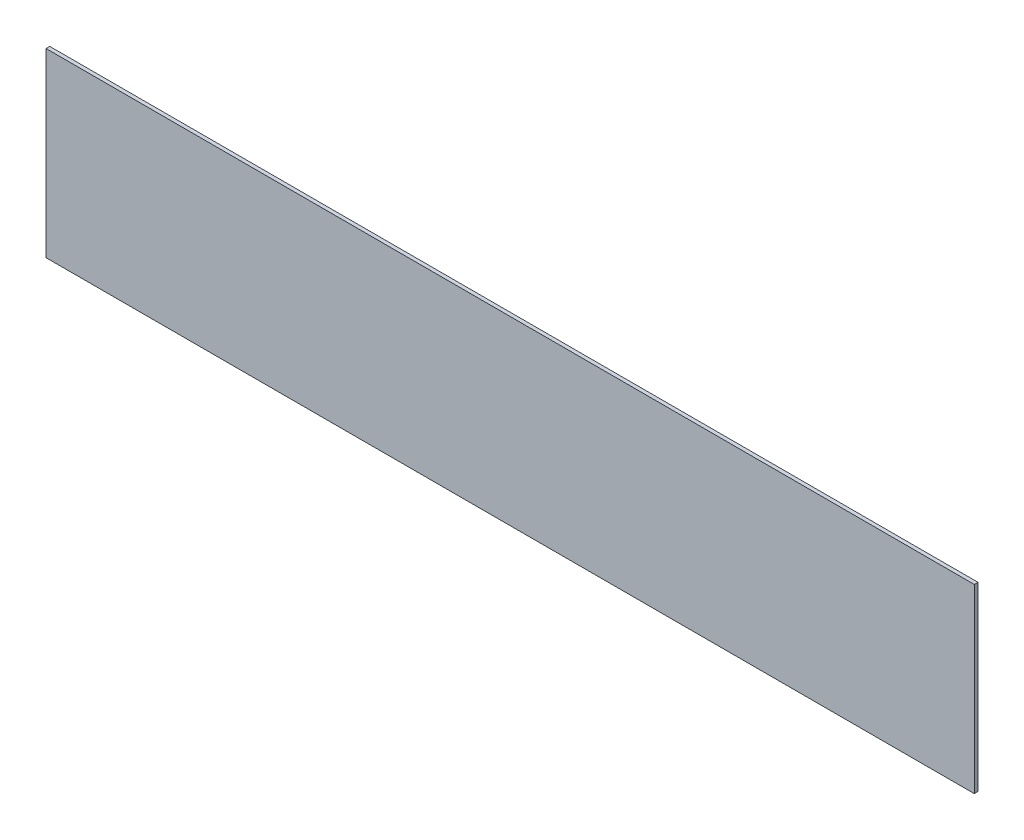
ISO-10303-21;
HEADER;
FILE_DESCRIPTION(('STEP AP214'),'2;1');
FILE_NAME('part.step','',(''),(''),'','','');
FILE_SCHEMA(('AUTOMOTIVE_DESIGN { 1 0 10303 214 1 1 1 1 }'));
ENDSEC;
DATA;
#1=APPLICATION_CONTEXT('core data for automotive mechanical design processes');
#2=APPLICATION_PROTOCOL_DEFINITION('international standard','automotive_design',2000,#1);
#3=PRODUCT_CONTEXT('',#1,'mechanical');
#4=PRODUCT('Part','Part','',(#3));
#5=PRODUCT_RELATED_PRODUCT_CATEGORY('part','',(#4));
#6=PRODUCT_DEFINITION_FORMATION('','',#4);
#7=PRODUCT_DEFINITION_CONTEXT('part definition',#1,'design');
#8=PRODUCT_DEFINITION('design','',#6,#7);
#9=PRODUCT_DEFINITION_SHAPE('','',#8);
#10=(LENGTH_UNIT() NAMED_UNIT(*) SI_UNIT(.MILLI.,.METRE.));
#11=(NAMED_UNIT(*) PLANE_ANGLE_UNIT() SI_UNIT($,.RADIAN.));
#12=(NAMED_UNIT(*) SI_UNIT($,.STERADIAN.) SOLID_ANGLE_UNIT());
#13=UNCERTAINTY_MEASURE_WITH_UNIT(LENGTH_MEASURE(1.E-05),#10,'distance_accuracy_value','');
#14=(GEOMETRIC_REPRESENTATION_CONTEXT(3) GLOBAL_UNCERTAINTY_ASSIGNED_CONTEXT((#13)) GLOBAL_UNIT_ASSIGNED_CONTEXT((#10,
#11,#12)) REPRESENTATION_CONTEXT('',''));
#15=CARTESIAN_POINT('',(0.,0.,0.));
#16=DIRECTION('',(0.,0.,1.));
#17=DIRECTION('',(1.,0.,0.));
#18=AXIS2_PLACEMENT_3D('',#15,#16,#17);
#19=CARTESIAN_POINT('',(251.04,0.,1.));
#20=DIRECTION('',(0.,1.,0.));
#21=DIRECTION('',(-1.,0.,0.));
#22=AXIS2_PLACEMENT_3D('',#19,#20,#21);
#23=PLANE('',#22);
#24=DIRECTION('',(1.,0.,0.));
#25=VECTOR('',#24,1.);
#26=CARTESIAN_POINT('',(251.04,0.,0.));
#27=LINE('',#26,#25);
#28=CARTESIAN_POINT('',(0.,0.,0.));
#29=VERTEX_POINT('',#28);
#30=CARTESIAN_POINT('',(251.04,0.,0.));
#31=VERTEX_POINT('',#30);
#32=EDGE_CURVE('E96',#29,#31,#27,.T.);
#33=ORIENTED_EDGE('',*,*,#32,.T.);
#34=DIRECTION('',(0.,0.,-1.));
#35=VECTOR('',#34,1.);
#36=CARTESIAN_POINT('',(251.04,0.,1.));
#37=LINE('',#36,#35);
#38=CARTESIAN_POINT('',(251.04,0.,1.));
#39=VERTEX_POINT('',#38);
#40=EDGE_CURVE('E11',#39,#31,#37,.T.);
#41=ORIENTED_EDGE('',*,*,#40,.F.);
#42=DIRECTION('',(1.,0.,0.));
#43=VECTOR('',#42,1.);
#44=CARTESIAN_POINT('',(251.04,0.,1.));
#45=LINE('',#44,#43);
#46=CARTESIAN_POINT('',(0.,0.,1.));
#47=VERTEX_POINT('',#46);
#48=EDGE_CURVE('E84',#47,#39,#45,.T.);
#49=ORIENTED_EDGE('',*,*,#48,.F.);
#50=DIRECTION('',(0.,0.,-1.));
#51=VECTOR('',#50,1.);
#52=CARTESIAN_POINT('',(0.,0.,1.));
#53=LINE('',#52,#51);
#54=EDGE_CURVE('E92',#47,#29,#53,.T.);
#55=ORIENTED_EDGE('',*,*,#54,.T.);
#56=EDGE_LOOP('',(#33,#41,#49,#55));
#57=FACE_BOUND('',#56,.T.);
#58=ADVANCED_FACE('F33',(#57),#23,.F.);
#59=CARTESIAN_POINT('',(251.04,49.,1.));
#60=DIRECTION('',(-1.,0.,0.));
#61=DIRECTION('',(0.,0.,1.));
#62=AXIS2_PLACEMENT_3D('',#59,#60,#61);
#63=PLANE('',#62);
#64=DIRECTION('',(0.,1.,0.));
#65=VECTOR('',#64,1.);
#66=CARTESIAN_POINT('',(251.04,49.,0.));
#67=LINE('',#66,#65);
#68=CARTESIAN_POINT('',(251.04,49.,0.));
#69=VERTEX_POINT('',#68);
#70=EDGE_CURVE('E88',#31,#69,#67,.T.);
#71=ORIENTED_EDGE('',*,*,#70,.T.);
#72=DIRECTION('',(0.,0.,-1.));
#73=VECTOR('',#72,1.);
#74=CARTESIAN_POINT('',(251.04,49.,1.));
#75=LINE('',#74,#73);
#76=CARTESIAN_POINT('',(251.04,49.,1.));
#77=VERTEX_POINT('',#76);
#78=EDGE_CURVE('E41',#77,#69,#75,.T.);
#79=ORIENTED_EDGE('',*,*,#78,.F.);
#80=DIRECTION('',(0.,1.,0.));
#81=VECTOR('',#80,1.);
#82=CARTESIAN_POINT('',(251.04,49.,1.));
#83=LINE('',#82,#81);
#84=EDGE_CURVE('E79',#39,#77,#83,.T.);
#85=ORIENTED_EDGE('',*,*,#84,.F.);
#86=ORIENTED_EDGE('',*,*,#40,.T.);
#87=EDGE_LOOP('',(#71,#79,#85,#86));
#88=FACE_BOUND('',#87,.T.);
#89=ADVANCED_FACE('F87',(#88),#63,.F.);
#90=CARTESIAN_POINT('',(0.,49.,1.));
#91=DIRECTION('',(0.,-1.,0.));
#92=DIRECTION('',(0.,0.,-1.));
#93=AXIS2_PLACEMENT_3D('',#90,#91,#92);
#94=PLANE('',#93);
#95=DIRECTION('',(-1.,0.,0.));
#96=VECTOR('',#95,1.);
#97=CARTESIAN_POINT('',(0.,49.,0.));
#98=LINE('',#97,#96);
#99=CARTESIAN_POINT('',(0.,49.,0.));
#100=VERTEX_POINT('',#99);
#101=EDGE_CURVE('E66',#69,#100,#98,.T.);
#102=ORIENTED_EDGE('',*,*,#101,.T.);
#103=DIRECTION('',(0.,0.,-1.));
#104=VECTOR('',#103,1.);
#105=CARTESIAN_POINT('',(0.,49.,1.));
#106=LINE('',#105,#104);
#107=CARTESIAN_POINT('',(0.,49.,1.));
#108=VERTEX_POINT('',#107);
#109=EDGE_CURVE('E89',#108,#100,#106,.T.);
#110=ORIENTED_EDGE('',*,*,#109,.F.);
#111=DIRECTION('',(-1.,0.,0.));
#112=VECTOR('',#111,1.);
#113=CARTESIAN_POINT('',(0.,49.,1.));
#114=LINE('',#113,#112);
#115=EDGE_CURVE('E82',#77,#108,#114,.T.);
#116=ORIENTED_EDGE('',*,*,#115,.F.);
#117=ORIENTED_EDGE('',*,*,#78,.T.);
#118=EDGE_LOOP('',(#102,#110,#116,#117));
#119=FACE_BOUND('',#118,.T.);
#120=ADVANCED_FACE('F90',(#119),#94,.F.);
#121=CARTESIAN_POINT('',(0.,0.,1.));
#122=DIRECTION('',(1.,0.,0.));
#123=DIRECTION('',(0.,0.,-1.));
#124=AXIS2_PLACEMENT_3D('',#121,#122,#123);
#125=PLANE('',#124);
#126=DIRECTION('',(0.,-1.,0.));
#127=VECTOR('',#126,1.);
#128=CARTESIAN_POINT('',(0.,0.,0.));
#129=LINE('',#128,#127);
#130=EDGE_CURVE('E72',#100,#29,#129,.T.);
#131=ORIENTED_EDGE('',*,*,#130,.T.);
#132=ORIENTED_EDGE('',*,*,#54,.F.);
#133=DIRECTION('',(0.,-1.,0.));
#134=VECTOR('',#133,1.);
#135=CARTESIAN_POINT('',(0.,0.,1.));
#136=LINE('',#135,#134);
#137=EDGE_CURVE('E49',#108,#47,#136,.T.);
#138=ORIENTED_EDGE('',*,*,#137,.F.);
#139=ORIENTED_EDGE('',*,*,#109,.T.);
#140=EDGE_LOOP('',(#131,#132,#138,#139));
#141=FACE_BOUND('',#140,.T.);
#142=ADVANCED_FACE('F103',(#141),#125,.F.);
#143=CARTESIAN_POINT('',(0.,0.,1.));
#144=DIRECTION('',(0.,0.,-1.));
#145=DIRECTION('',(-1.,0.,0.));
#146=AXIS2_PLACEMENT_3D('',#143,#144,#145);
#147=PLANE('',#146);
#148=ORIENTED_EDGE('',*,*,#48,.T.);
#149=ORIENTED_EDGE('',*,*,#84,.T.);
#150=ORIENTED_EDGE('',*,*,#115,.T.);
#151=ORIENTED_EDGE('',*,*,#137,.T.);
#152=EDGE_LOOP('',(#148,#149,#150,#151));
#153=FACE_BOUND('',#152,.T.);
#154=ADVANCED_FACE('F80',(#153),#147,.F.);
#155=CARTESIAN_POINT('',(0.,0.,0.));
#156=DIRECTION('',(0.,0.,-1.));
#157=DIRECTION('',(-1.,0.,0.));
#158=AXIS2_PLACEMENT_3D('',#155,#156,#157);
#159=PLANE('',#158);
#160=ORIENTED_EDGE('',*,*,#32,.F.);
#161=ORIENTED_EDGE('',*,*,#130,.F.);
#162=ORIENTED_EDGE('',*,*,#101,.F.);
#163=ORIENTED_EDGE('',*,*,#70,.F.);
#164=EDGE_LOOP('',(#160,#161,#162,#163));
#165=FACE_BOUND('',#164,.T.);
#166=ADVANCED_FACE('F106',(#165),#159,.T.);
#167=CLOSED_SHELL('',(#58,#89,#120,#142,#154,#166));
#168=MANIFOLD_SOLID_BREP('B2',#167);
#169=ADVANCED_BREP_SHAPE_REPRESENTATION('',(#18,#168),#14);
#170=SHAPE_DEFINITION_REPRESENTATION(#9,#169);
ENDSEC;
END-ISO-10303-21;
